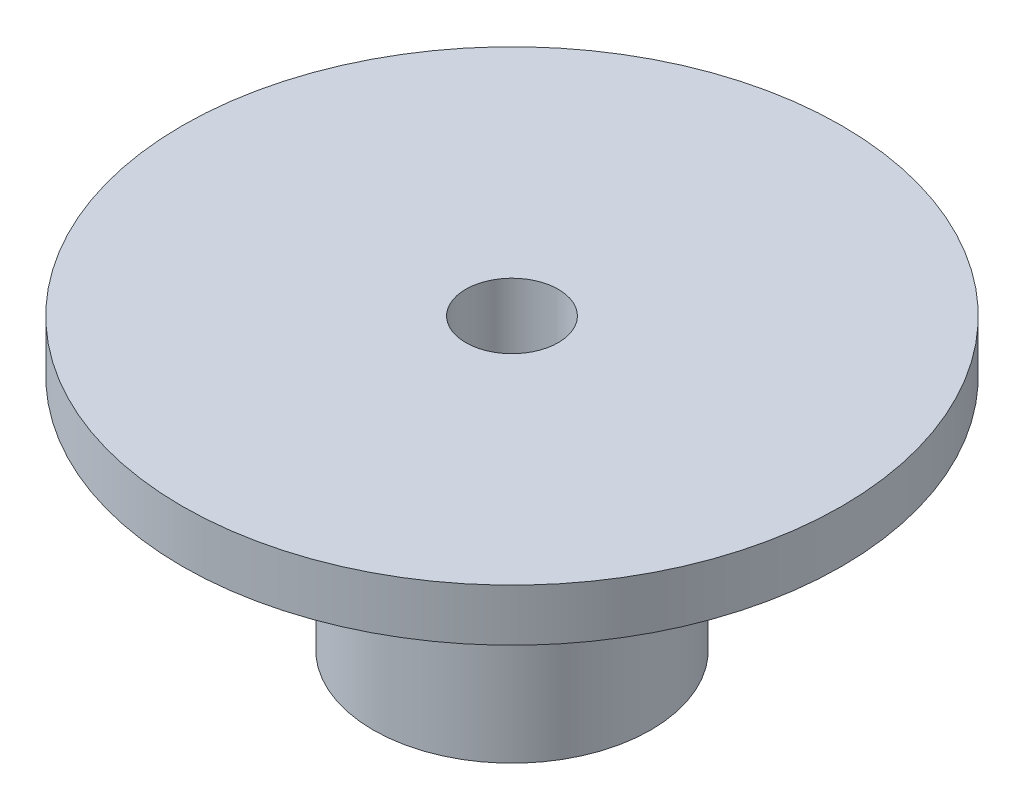
ISO-10303-21;
HEADER;
FILE_DESCRIPTION(('STEP AP214'),'2;1');
FILE_NAME('part.step','',(''),(''),'','','');
FILE_SCHEMA(('AUTOMOTIVE_DESIGN { 1 0 10303 214 1 1 1 1 }'));
ENDSEC;
DATA;
#1=APPLICATION_CONTEXT('core data for automotive mechanical design processes');
#2=APPLICATION_PROTOCOL_DEFINITION('international standard','automotive_design',2000,#1);
#3=PRODUCT_CONTEXT('',#1,'mechanical');
#4=PRODUCT('Part','Part','',(#3));
#5=PRODUCT_RELATED_PRODUCT_CATEGORY('part','',(#4));
#6=PRODUCT_DEFINITION_FORMATION('','',#4);
#7=PRODUCT_DEFINITION_CONTEXT('part definition',#1,'design');
#8=PRODUCT_DEFINITION('design','',#6,#7);
#9=PRODUCT_DEFINITION_SHAPE('','',#8);
#10=(LENGTH_UNIT() NAMED_UNIT(*) SI_UNIT(.MILLI.,.METRE.));
#11=(NAMED_UNIT(*) PLANE_ANGLE_UNIT() SI_UNIT($,.RADIAN.));
#12=(NAMED_UNIT(*) SI_UNIT($,.STERADIAN.) SOLID_ANGLE_UNIT());
#13=UNCERTAINTY_MEASURE_WITH_UNIT(LENGTH_MEASURE(1.E-05),#10,'distance_accuracy_value','');
#14=(GEOMETRIC_REPRESENTATION_CONTEXT(3) GLOBAL_UNCERTAINTY_ASSIGNED_CONTEXT((#13)) GLOBAL_UNIT_ASSIGNED_CONTEXT((#10,
#11,#12)) REPRESENTATION_CONTEXT('',''));
#15=CARTESIAN_POINT('',(0.,0.,0.));
#16=DIRECTION('',(0.,0.,1.));
#17=DIRECTION('',(1.,0.,0.));
#18=AXIS2_PLACEMENT_3D('',#15,#16,#17);
#19=CARTESIAN_POINT('',(0.,0.,0.));
#20=DIRECTION('',(0.,1.,0.));
#21=DIRECTION('',(0.,0.,1.));
#22=AXIS2_PLACEMENT_3D('',#19,#20,#21);
#23=PLANE('',#22);
#24=CARTESIAN_POINT('',(0.,0.,0.));
#25=DIRECTION('',(0.,1.,0.));
#26=DIRECTION('',(0.,0.,1.));
#27=AXIS2_PLACEMENT_3D('',#24,#25,#26);
#28=CIRCLE('',#27,4.);
#29=CARTESIAN_POINT('',(0.,0.,4.));
#30=VERTEX_POINT('',#29);
#31=EDGE_CURVE('E43',#30,#30,#28,.T.);
#32=ORIENTED_EDGE('',*,*,#31,.T.);
#33=EDGE_LOOP('',(#32));
#34=FACE_BOUND('',#33,.T.);
#35=CARTESIAN_POINT('',(0.,0.,0.));
#36=DIRECTION('',(0.,-1.,0.));
#37=DIRECTION('',(0.,0.,-1.));
#38=AXIS2_PLACEMENT_3D('',#35,#36,#37);
#39=CIRCLE('',#38,12.);
#40=CARTESIAN_POINT('',(0.,0.,-12.));
#41=VERTEX_POINT('',#40);
#42=EDGE_CURVE('E48',#41,#41,#39,.T.);
#43=ORIENTED_EDGE('',*,*,#42,.T.);
#44=EDGE_LOOP('',(#43));
#45=FACE_BOUND('',#44,.T.);
#46=ADVANCED_FACE('F31',(#34,#45),#23,.F.);
#47=CARTESIAN_POINT('',(0.,25.,0.));
#48=DIRECTION('',(0.,-1.,0.));
#49=DIRECTION('',(0.,0.,-1.));
#50=AXIS2_PLACEMENT_3D('',#47,#48,#49);
#51=CYLINDRICAL_SURFACE('',#50,28.5);
#52=CARTESIAN_POINT('',(0.,25.,0.));
#53=DIRECTION('',(0.,1.,0.));
#54=DIRECTION('',(0.,0.,1.));
#55=AXIS2_PLACEMENT_3D('',#52,#53,#54);
#56=CIRCLE('',#55,28.5);
#57=CARTESIAN_POINT('',(0.,25.,28.5));
#58=VERTEX_POINT('',#57);
#59=EDGE_CURVE('E11',#58,#58,#56,.T.);
#60=ORIENTED_EDGE('',*,*,#59,.F.);
#61=EDGE_LOOP('',(#60));
#62=FACE_BOUND('',#61,.T.);
#63=CARTESIAN_POINT('',(0.,20.5,0.));
#64=DIRECTION('',(0.,-1.,0.));
#65=DIRECTION('',(0.,0.,-1.));
#66=AXIS2_PLACEMENT_3D('',#63,#64,#65);
#67=CIRCLE('',#66,28.5);
#68=CARTESIAN_POINT('',(0.,20.5,-28.5));
#69=VERTEX_POINT('',#68);
#70=EDGE_CURVE('E35',#69,#69,#67,.T.);
#71=ORIENTED_EDGE('',*,*,#70,.F.);
#72=EDGE_LOOP('',(#71));
#73=FACE_BOUND('',#72,.T.);
#74=ADVANCED_FACE('F33',(#62,#73),#51,.T.);
#75=CARTESIAN_POINT('',(0.,25.,0.));
#76=DIRECTION('',(0.,1.,0.));
#77=DIRECTION('',(0.,0.,1.));
#78=AXIS2_PLACEMENT_3D('',#75,#76,#77);
#79=PLANE('',#78);
#80=ORIENTED_EDGE('',*,*,#59,.T.);
#81=EDGE_LOOP('',(#80));
#82=FACE_BOUND('',#81,.T.);
#83=CARTESIAN_POINT('',(0.,25.,0.));
#84=DIRECTION('',(0.,1.,0.));
#85=DIRECTION('',(0.,0.,1.));
#86=AXIS2_PLACEMENT_3D('',#83,#84,#85);
#87=CIRCLE('',#86,4.);
#88=CARTESIAN_POINT('',(0.,25.,4.));
#89=VERTEX_POINT('',#88);
#90=EDGE_CURVE('E39',#89,#89,#87,.T.);
#91=ORIENTED_EDGE('',*,*,#90,.F.);
#92=EDGE_LOOP('',(#91));
#93=FACE_BOUND('',#92,.T.);
#94=ADVANCED_FACE('F61',(#82,#93),#79,.T.);
#95=CARTESIAN_POINT('',(0.,25.,0.));
#96=DIRECTION('',(0.,-1.,0.));
#97=DIRECTION('',(0.,0.,-1.));
#98=AXIS2_PLACEMENT_3D('',#95,#96,#97);
#99=CYLINDRICAL_SURFACE('',#98,4.);
#100=ORIENTED_EDGE('',*,*,#90,.T.);
#101=EDGE_LOOP('',(#100));
#102=FACE_BOUND('',#101,.T.);
#103=ORIENTED_EDGE('',*,*,#31,.F.);
#104=EDGE_LOOP('',(#103));
#105=FACE_BOUND('',#104,.T.);
#106=ADVANCED_FACE('F67',(#102,#105),#99,.F.);
#107=CARTESIAN_POINT('',(0.,20.5,0.));
#108=DIRECTION('',(0.,-1.,0.));
#109=DIRECTION('',(0.,0.,-1.));
#110=AXIS2_PLACEMENT_3D('',#107,#108,#109);
#111=PLANE('',#110);
#112=CARTESIAN_POINT('',(0.,20.5,0.));
#113=DIRECTION('',(0.,-1.,0.));
#114=DIRECTION('',(0.,0.,-1.));
#115=AXIS2_PLACEMENT_3D('',#112,#113,#114);
#116=CIRCLE('',#115,12.);
#117=CARTESIAN_POINT('',(0.,20.5,-12.));
#118=VERTEX_POINT('',#117);
#119=EDGE_CURVE('E51',#118,#118,#116,.T.);
#120=ORIENTED_EDGE('',*,*,#119,.F.);
#121=EDGE_LOOP('',(#120));
#122=FACE_BOUND('',#121,.T.);
#123=ORIENTED_EDGE('',*,*,#70,.T.);
#124=EDGE_LOOP('',(#123));
#125=FACE_BOUND('',#124,.T.);
#126=ADVANCED_FACE('F58',(#122,#125),#111,.T.);
#127=CARTESIAN_POINT('',(0.,20.5,0.));
#128=DIRECTION('',(0.,-1.,0.));
#129=DIRECTION('',(0.,0.,-1.));
#130=AXIS2_PLACEMENT_3D('',#127,#128,#129);
#131=CYLINDRICAL_SURFACE('',#130,12.);
#132=ORIENTED_EDGE('',*,*,#119,.T.);
#133=EDGE_LOOP('',(#132));
#134=FACE_BOUND('',#133,.T.);
#135=ORIENTED_EDGE('',*,*,#42,.F.);
#136=EDGE_LOOP('',(#135));
#137=FACE_BOUND('',#136,.T.);
#138=ADVANCED_FACE('F79',(#134,#137),#131,.T.);
#139=CLOSED_SHELL('',(#46,#74,#94,#106,#126,#138));
#140=MANIFOLD_SOLID_BREP('B2',#139);
#141=ADVANCED_BREP_SHAPE_REPRESENTATION('',(#18,#140),#14);
#142=SHAPE_DEFINITION_REPRESENTATION(#9,#141);
ENDSEC;
END-ISO-10303-21;
